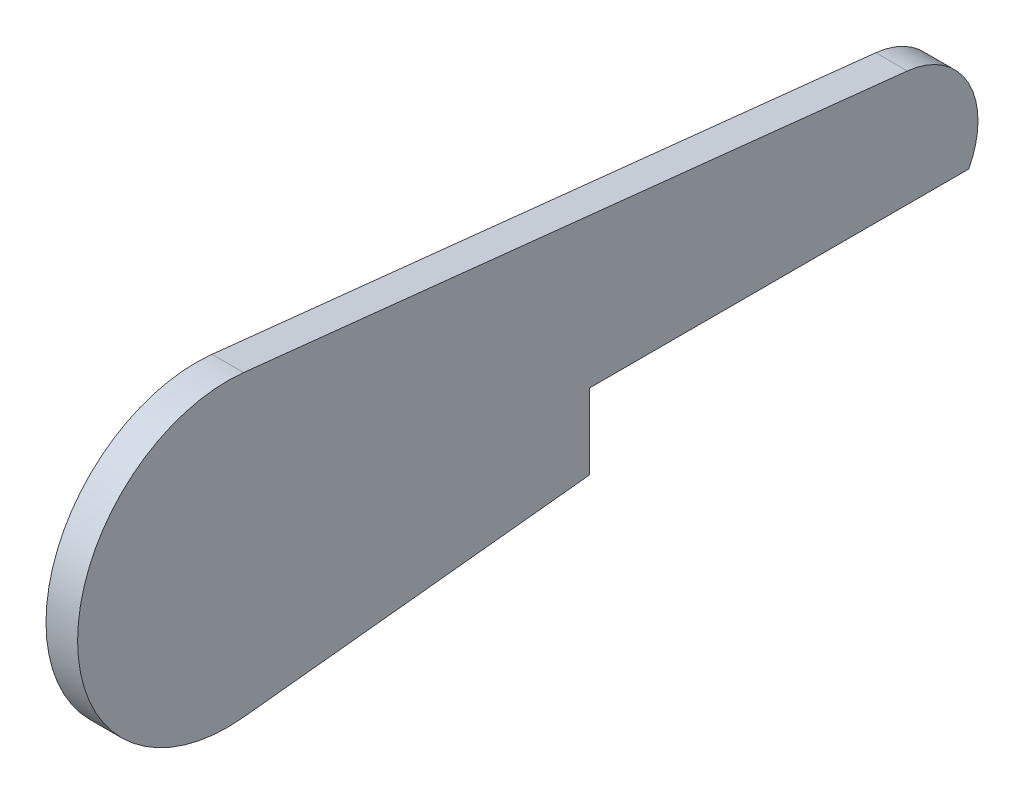
ISO-10303-21;
HEADER;
FILE_DESCRIPTION(('STEP AP214'),'2;1');
FILE_NAME('part.step','',(''),(''),'','','');
FILE_SCHEMA(('AUTOMOTIVE_DESIGN { 1 0 10303 214 1 1 1 1 }'));
ENDSEC;
DATA;
#1=APPLICATION_CONTEXT('core data for automotive mechanical design processes');
#2=APPLICATION_PROTOCOL_DEFINITION('international standard','automotive_design',2000,#1);
#3=PRODUCT_CONTEXT('',#1,'mechanical');
#4=PRODUCT('Part','Part','',(#3));
#5=PRODUCT_RELATED_PRODUCT_CATEGORY('part','',(#4));
#6=PRODUCT_DEFINITION_FORMATION('','',#4);
#7=PRODUCT_DEFINITION_CONTEXT('part definition',#1,'design');
#8=PRODUCT_DEFINITION('design','',#6,#7);
#9=PRODUCT_DEFINITION_SHAPE('','',#8);
#10=(LENGTH_UNIT() NAMED_UNIT(*) SI_UNIT(.MILLI.,.METRE.));
#11=(NAMED_UNIT(*) PLANE_ANGLE_UNIT() SI_UNIT($,.RADIAN.));
#12=(NAMED_UNIT(*) SI_UNIT($,.STERADIAN.) SOLID_ANGLE_UNIT());
#13=UNCERTAINTY_MEASURE_WITH_UNIT(LENGTH_MEASURE(1.E-05),#10,'distance_accuracy_value','');
#14=(GEOMETRIC_REPRESENTATION_CONTEXT(3) GLOBAL_UNCERTAINTY_ASSIGNED_CONTEXT((#13)) GLOBAL_UNIT_ASSIGNED_CONTEXT((#10,
#11,#12)) REPRESENTATION_CONTEXT('',''));
#15=CARTESIAN_POINT('',(0.,0.,0.));
#16=DIRECTION('',(0.,0.,1.));
#17=DIRECTION('',(1.,0.,0.));
#18=AXIS2_PLACEMENT_3D('',#15,#16,#17);
#19=CARTESIAN_POINT('',(5.,0.,0.));
#20=DIRECTION('',(-1.,0.,0.));
#21=DIRECTION('',(0.,0.,1.));
#22=AXIS2_PLACEMENT_3D('',#19,#20,#21);
#23=CYLINDRICAL_SURFACE('',#22,95.);
#24=DIRECTION('',(-1.,0.,0.));
#25=VECTOR('',#24,1.);
#26=CARTESIAN_POINT('',(5.,94.4659730760455,-10.0588235294118));
#27=LINE('',#26,#25);
#28=CARTESIAN_POINT('',(5.,94.4659730760455,-10.0588235294118));
#29=VERTEX_POINT('',#28);
#30=CARTESIAN_POINT('',(-15.,94.4659730760455,-10.0588235294117));
#31=VERTEX_POINT('',#30);
#32=EDGE_CURVE('E165',#29,#31,#27,.T.);
#33=ORIENTED_EDGE('',*,*,#32,.T.);
#34=CARTESIAN_POINT('',(-15.,0.,0.));
#35=DIRECTION('',(-1.,0.,0.));
#36=DIRECTION('',(0.,0.,1.));
#37=AXIS2_PLACEMENT_3D('',#34,#35,#36);
#38=CIRCLE('',#37,95.);
#39=CARTESIAN_POINT('',(-15.,-94.4659730760455,-10.0588235294117));
#40=VERTEX_POINT('',#39);
#41=EDGE_CURVE('E198',#40,#31,#38,.T.);
#42=ORIENTED_EDGE('',*,*,#41,.F.);
#43=DIRECTION('',(-1.,0.,0.));
#44=VECTOR('',#43,1.);
#45=CARTESIAN_POINT('',(5.,-94.4659730760455,-10.0588235294118));
#46=LINE('',#45,#44);
#47=CARTESIAN_POINT('',(5.,-94.4659730760455,-10.0588235294118));
#48=VERTEX_POINT('',#47);
#49=EDGE_CURVE('E147',#48,#40,#46,.T.);
#50=ORIENTED_EDGE('',*,*,#49,.F.);
#51=CARTESIAN_POINT('',(5.,0.,0.));
#52=DIRECTION('',(1.,0.,0.));
#53=DIRECTION('',(0.,0.,-1.));
#54=AXIS2_PLACEMENT_3D('',#51,#52,#53);
#55=CIRCLE('',#54,95.);
#56=EDGE_CURVE('E149',#29,#48,#55,.T.);
#57=ORIENTED_EDGE('',*,*,#56,.F.);
#58=EDGE_LOOP('',(#33,#42,#50,#57));
#59=FACE_BOUND('',#58,.T.);
#60=ADVANCED_FACE('F41',(#59),#23,.T.);
#61=CARTESIAN_POINT('',(5.,-49.7189331979187,-430.294117647059));
#62=DIRECTION('',(0.,0.994378663958374,0.105882352941176));
#63=DIRECTION('',(0.,-0.105882352941177,0.994378663958374));
#64=AXIS2_PLACEMENT_3D('',#61,#62,#63);
#65=PLANE('',#64);
#66=DIRECTION('',(0.,-0.105882352941176,0.994378663958374));
#67=VECTOR('',#66,1.);
#68=CARTESIAN_POINT('',(-15.,-49.7189331979187,-430.294117647059));
#69=LINE('',#68,#67);
#70=CARTESIAN_POINT('',(-15.,-71.1439222210405,-229.084460245787));
#71=VERTEX_POINT('',#70);
#72=EDGE_CURVE('E139',#71,#40,#69,.T.);
#73=ORIENTED_EDGE('',*,*,#72,.F.);
#74=DIRECTION('',(1.,0.,0.));
#75=VECTOR('',#74,1.);
#76=CARTESIAN_POINT('',(-15.,-71.1439222210405,-229.084460245787));
#77=LINE('',#76,#75);
#78=CARTESIAN_POINT('',(5.,-71.1439222210405,-229.084460245787));
#79=VERTEX_POINT('',#78);
#80=EDGE_CURVE('E122',#71,#79,#77,.T.);
#81=ORIENTED_EDGE('',*,*,#80,.T.);
#82=DIRECTION('',(0.,0.105882352941176,-0.994378663958374));
#83=VECTOR('',#82,1.);
#84=CARTESIAN_POINT('',(5.,-49.7189331979187,-430.294117647059));
#85=LINE('',#84,#83);
#86=EDGE_CURVE('E153',#48,#79,#85,.T.);
#87=ORIENTED_EDGE('',*,*,#86,.F.);
#88=ORIENTED_EDGE('',*,*,#49,.T.);
#89=EDGE_LOOP('',(#73,#81,#87,#88));
#90=FACE_BOUND('',#89,.T.);
#91=ADVANCED_FACE('F145',(#90),#65,.F.);
#92=CARTESIAN_POINT('',(5.,0.,-425.));
#93=DIRECTION('',(-1.,0.,0.));
#94=DIRECTION('',(0.,0.,1.));
#95=AXIS2_PLACEMENT_3D('',#92,#93,#94);
#96=CYLINDRICAL_SURFACE('',#95,50.);
#97=CARTESIAN_POINT('',(5.,0.,-425.));
#98=DIRECTION('',(1.,0.,0.));
#99=DIRECTION('',(0.,0.,-1.));
#100=AXIS2_PLACEMENT_3D('',#97,#98,#99);
#101=CIRCLE('',#100,50.);
#102=CARTESIAN_POINT('',(5.,-23.5038972967356,-469.131245301538));
#103=VERTEX_POINT('',#102);
#104=CARTESIAN_POINT('',(5.,49.7189331979187,-430.294117647059));
#105=VERTEX_POINT('',#104);
#106=EDGE_CURVE('E161',#103,#105,#101,.T.);
#107=ORIENTED_EDGE('',*,*,#106,.F.);
#108=DIRECTION('',(1.,0.,0.));
#109=VECTOR('',#108,1.);
#110=CARTESIAN_POINT('',(-15.,-23.5038972967356,-469.131245301538));
#111=LINE('',#110,#109);
#112=CARTESIAN_POINT('',(-15.,-23.5038972967356,-469.131245301538));
#113=VERTEX_POINT('',#112);
#114=EDGE_CURVE('E131',#113,#103,#111,.T.);
#115=ORIENTED_EDGE('',*,*,#114,.F.);
#116=CARTESIAN_POINT('',(-15.,0.,-425.));
#117=DIRECTION('',(-1.,0.,0.));
#118=DIRECTION('',(0.,0.,1.));
#119=AXIS2_PLACEMENT_3D('',#116,#117,#118);
#120=CIRCLE('',#119,50.);
#121=CARTESIAN_POINT('',(-15.,49.7189331979187,-430.294117647059));
#122=VERTEX_POINT('',#121);
#123=EDGE_CURVE('E150',#122,#113,#120,.T.);
#124=ORIENTED_EDGE('',*,*,#123,.F.);
#125=DIRECTION('',(-1.,0.,0.));
#126=VECTOR('',#125,1.);
#127=CARTESIAN_POINT('',(5.,49.7189331979187,-430.294117647059));
#128=LINE('',#127,#126);
#129=EDGE_CURVE('E167',#105,#122,#128,.T.);
#130=ORIENTED_EDGE('',*,*,#129,.F.);
#131=EDGE_LOOP('',(#107,#115,#124,#130));
#132=FACE_BOUND('',#131,.T.);
#133=ADVANCED_FACE('F208',(#132),#96,.T.);
#134=CARTESIAN_POINT('',(5.,94.4659730760455,-10.0588235294118));
#135=DIRECTION('',(0.,-0.994378663958374,0.105882352941176));
#136=DIRECTION('',(0.,-0.105882352941176,-0.994378663958374));
#137=AXIS2_PLACEMENT_3D('',#134,#135,#136);
#138=PLANE('',#137);
#139=ORIENTED_EDGE('',*,*,#129,.T.);
#140=DIRECTION('',(0.,-0.105882352941176,-0.994378663958374));
#141=VECTOR('',#140,1.);
#142=CARTESIAN_POINT('',(-15.,94.4659730760455,-10.0588235294117));
#143=LINE('',#142,#141);
#144=EDGE_CURVE('E156',#31,#122,#143,.T.);
#145=ORIENTED_EDGE('',*,*,#144,.F.);
#146=ORIENTED_EDGE('',*,*,#32,.F.);
#147=DIRECTION('',(0.,0.105882352941176,0.994378663958374));
#148=VECTOR('',#147,1.);
#149=CARTESIAN_POINT('',(5.,94.4659730760455,-10.0588235294118));
#150=LINE('',#149,#148);
#151=EDGE_CURVE('E163',#105,#29,#150,.T.);
#152=ORIENTED_EDGE('',*,*,#151,.F.);
#153=EDGE_LOOP('',(#139,#145,#146,#152));
#154=FACE_BOUND('',#153,.T.);
#155=ADVANCED_FACE('F253',(#154),#138,.F.);
#156=CARTESIAN_POINT('',(5.,0.,0.));
#157=DIRECTION('',(1.,0.,0.));
#158=DIRECTION('',(0.,0.,-1.));
#159=AXIS2_PLACEMENT_3D('',#156,#157,#158);
#160=PLANE('',#159);
#161=DIRECTION('',(0.,0.,1.));
#162=VECTOR('',#161,1.);
#163=CARTESIAN_POINT('',(5.,-23.5038972967356,0.));
#164=LINE('',#163,#162);
#165=CARTESIAN_POINT('',(5.,-23.5038972967356,-229.084460245776));
#166=VERTEX_POINT('',#165);
#167=EDGE_CURVE('E248',#103,#166,#164,.T.);
#168=ORIENTED_EDGE('',*,*,#167,.F.);
#169=ORIENTED_EDGE('',*,*,#106,.T.);
#170=ORIENTED_EDGE('',*,*,#151,.T.);
#171=ORIENTED_EDGE('',*,*,#56,.T.);
#172=ORIENTED_EDGE('',*,*,#86,.T.);
#173=DIRECTION('',(0.,-1.,0.));
#174=VECTOR('',#173,1.);
#175=CARTESIAN_POINT('',(5.,0.,-229.084460245776));
#176=LINE('',#175,#174);
#177=EDGE_CURVE('E127',#166,#79,#176,.T.);
#178=ORIENTED_EDGE('',*,*,#177,.F.);
#179=EDGE_LOOP('',(#168,#169,#170,#171,#172,#178));
#180=FACE_BOUND('',#179,.T.);
#181=ADVANCED_FACE('F250',(#180),#160,.T.);
#182=CARTESIAN_POINT('',(-15.,0.,0.));
#183=DIRECTION('',(-1.,0.,0.));
#184=DIRECTION('',(0.,0.,1.));
#185=AXIS2_PLACEMENT_3D('',#182,#183,#184);
#186=PLANE('',#185);
#187=DIRECTION('',(0.,0.,1.));
#188=VECTOR('',#187,1.);
#189=CARTESIAN_POINT('',(-15.,-23.5038972967356,0.));
#190=LINE('',#189,#188);
#191=CARTESIAN_POINT('',(-15.,-23.5038972967356,-463.374038253284));
#192=VERTEX_POINT('',#191);
#193=EDGE_CURVE('E143',#113,#192,#190,.T.);
#194=ORIENTED_EDGE('',*,*,#193,.T.);
#195=CARTESIAN_POINT('',(-15.,0.,-425.));
#196=DIRECTION('',(-1.,0.,0.));
#197=DIRECTION('',(0.,0.,1.));
#198=AXIS2_PLACEMENT_3D('',#195,#196,#197);
#199=CIRCLE('',#198,45.);
#200=CARTESIAN_POINT('',(-15.,44.7470398781268,-429.764705882353));
#201=VERTEX_POINT('',#200);
#202=EDGE_CURVE('E229',#201,#192,#199,.T.);
#203=ORIENTED_EDGE('',*,*,#202,.F.);
#204=DIRECTION('',(0.,-0.105882352941176,-0.994378663958374));
#205=VECTOR('',#204,1.);
#206=CARTESIAN_POINT('',(-15.,89.4940797562536,-9.52941176470582));
#207=LINE('',#206,#205);
#208=CARTESIAN_POINT('',(-15.,89.4940797562536,-9.52941176470582));
#209=VERTEX_POINT('',#208);
#210=EDGE_CURVE('E186',#209,#201,#207,.T.);
#211=ORIENTED_EDGE('',*,*,#210,.F.);
#212=CARTESIAN_POINT('',(-15.,0.,0.));
#213=DIRECTION('',(-1.,0.,0.));
#214=DIRECTION('',(0.,0.,1.));
#215=AXIS2_PLACEMENT_3D('',#212,#213,#214);
#216=CIRCLE('',#215,90.);
#217=CARTESIAN_POINT('',(-15.,-89.4940797562536,-9.52941176470587));
#218=VERTEX_POINT('',#217);
#219=EDGE_CURVE('E183',#218,#209,#216,.T.);
#220=ORIENTED_EDGE('',*,*,#219,.F.);
#221=DIRECTION('',(0.,-0.105882352941176,0.994378663958374));
#222=VECTOR('',#221,1.);
#223=CARTESIAN_POINT('',(-15.,-44.7470398781268,-429.764705882353));
#224=LINE('',#223,#222);
#225=CARTESIAN_POINT('',(-15.,-66.1156566505635,-229.084460245776));
#226=VERTEX_POINT('',#225);
#227=EDGE_CURVE('E142',#226,#218,#224,.T.);
#228=ORIENTED_EDGE('',*,*,#227,.F.);
#229=DIRECTION('',(0.,-1.,0.));
#230=VECTOR('',#229,1.);
#231=CARTESIAN_POINT('',(-15.,0.,-229.084460245776));
#232=LINE('',#231,#230);
#233=EDGE_CURVE('E125',#226,#71,#232,.T.);
#234=ORIENTED_EDGE('',*,*,#233,.T.);
#235=ORIENTED_EDGE('',*,*,#72,.T.);
#236=ORIENTED_EDGE('',*,*,#41,.T.);
#237=ORIENTED_EDGE('',*,*,#144,.T.);
#238=ORIENTED_EDGE('',*,*,#123,.T.);
#239=EDGE_LOOP('',(#194,#203,#211,#220,#228,#234,#235,#236,#237,#238));
#240=FACE_BOUND('',#239,.T.);
#241=ADVANCED_FACE('F137',(#240),#186,.T.);
#242=CARTESIAN_POINT('',(-15.,0.,0.));
#243=DIRECTION('',(1.,0.,0.));
#244=DIRECTION('',(0.,0.,-1.));
#245=AXIS2_PLACEMENT_3D('',#242,#243,#244);
#246=CYLINDRICAL_SURFACE('',#245,90.);
#247=CARTESIAN_POINT('',(0.,0.,0.));
#248=DIRECTION('',(-1.,0.,0.));
#249=DIRECTION('',(0.,0.,1.));
#250=AXIS2_PLACEMENT_3D('',#247,#248,#249);
#251=CIRCLE('',#250,90.);
#252=CARTESIAN_POINT('',(0.,-89.4940797562536,-9.52941176470587));
#253=VERTEX_POINT('',#252);
#254=CARTESIAN_POINT('',(0.,89.4940797562536,-9.52941176470582));
#255=VERTEX_POINT('',#254);
#256=EDGE_CURVE('E226',#253,#255,#251,.T.);
#257=ORIENTED_EDGE('',*,*,#256,.F.);
#258=DIRECTION('',(1.,0.,0.));
#259=VECTOR('',#258,1.);
#260=CARTESIAN_POINT('',(-15.,-89.4940797562536,-9.52941176470587));
#261=LINE('',#260,#259);
#262=EDGE_CURVE('E181',#218,#253,#261,.T.);
#263=ORIENTED_EDGE('',*,*,#262,.F.);
#264=ORIENTED_EDGE('',*,*,#219,.T.);
#265=DIRECTION('',(1.,0.,0.));
#266=VECTOR('',#265,1.);
#267=CARTESIAN_POINT('',(-15.,89.4940797562536,-9.52941176470582));
#268=LINE('',#267,#266);
#269=EDGE_CURVE('E195',#209,#255,#268,.T.);
#270=ORIENTED_EDGE('',*,*,#269,.T.);
#271=EDGE_LOOP('',(#257,#263,#264,#270));
#272=FACE_BOUND('',#271,.T.);
#273=ADVANCED_FACE('F241',(#272),#246,.F.);
#274=CARTESIAN_POINT('',(-15.,89.4940797562536,-9.52941176470582));
#275=DIRECTION('',(0.,-0.994378663958374,0.105882352941176));
#276=DIRECTION('',(0.,-0.105882352941176,-0.994378663958374));
#277=AXIS2_PLACEMENT_3D('',#274,#275,#276);
#278=PLANE('',#277);
#279=DIRECTION('',(0.,-0.105882352941176,-0.994378663958374));
#280=VECTOR('',#279,1.);
#281=CARTESIAN_POINT('',(0.,89.4940797562536,-9.52941176470582));
#282=LINE('',#281,#280);
#283=CARTESIAN_POINT('',(0.,44.7470398781268,-429.764705882353));
#284=VERTEX_POINT('',#283);
#285=EDGE_CURVE('E188',#255,#284,#282,.T.);
#286=ORIENTED_EDGE('',*,*,#285,.F.);
#287=ORIENTED_EDGE('',*,*,#269,.F.);
#288=ORIENTED_EDGE('',*,*,#210,.T.);
#289=DIRECTION('',(1.,0.,0.));
#290=VECTOR('',#289,1.);
#291=CARTESIAN_POINT('',(-15.,44.7470398781268,-429.764705882353));
#292=LINE('',#291,#290);
#293=EDGE_CURVE('E193',#201,#284,#292,.T.);
#294=ORIENTED_EDGE('',*,*,#293,.T.);
#295=EDGE_LOOP('',(#286,#287,#288,#294));
#296=FACE_BOUND('',#295,.T.);
#297=ADVANCED_FACE('F237',(#296),#278,.T.);
#298=CARTESIAN_POINT('',(-15.,0.,-425.));
#299=DIRECTION('',(1.,0.,0.));
#300=DIRECTION('',(0.,0.,-1.));
#301=AXIS2_PLACEMENT_3D('',#298,#299,#300);
#302=CYLINDRICAL_SURFACE('',#301,45.);
#303=DIRECTION('',(1.,0.,0.));
#304=VECTOR('',#303,1.);
#305=CARTESIAN_POINT('',(-15.,-23.5038972967356,-463.374038253284));
#306=LINE('',#305,#304);
#307=CARTESIAN_POINT('',(0.,-23.5038972967356,-463.374038253284));
#308=VERTEX_POINT('',#307);
#309=EDGE_CURVE('E214',#308,#192,#306,.F.);
#310=ORIENTED_EDGE('',*,*,#309,.F.);
#311=CARTESIAN_POINT('',(0.,0.,-425.));
#312=DIRECTION('',(-1.,0.,0.));
#313=DIRECTION('',(0.,0.,1.));
#314=AXIS2_PLACEMENT_3D('',#311,#312,#313);
#315=CIRCLE('',#314,45.);
#316=EDGE_CURVE('E184',#284,#308,#315,.T.);
#317=ORIENTED_EDGE('',*,*,#316,.F.);
#318=ORIENTED_EDGE('',*,*,#293,.F.);
#319=ORIENTED_EDGE('',*,*,#202,.T.);
#320=EDGE_LOOP('',(#310,#317,#318,#319));
#321=FACE_BOUND('',#320,.T.);
#322=ADVANCED_FACE('F245',(#321),#302,.F.);
#323=CARTESIAN_POINT('',(-15.,-44.7470398781268,-429.764705882353));
#324=DIRECTION('',(0.,0.994378663958374,0.105882352941176));
#325=DIRECTION('',(0.,-0.105882352941177,0.994378663958374));
#326=AXIS2_PLACEMENT_3D('',#323,#324,#325);
#327=PLANE('',#326);
#328=DIRECTION('',(1.,0.,0.));
#329=VECTOR('',#328,1.);
#330=CARTESIAN_POINT('',(-15.,-66.1156566505635,-229.084460245776));
#331=LINE('',#330,#329);
#332=CARTESIAN_POINT('',(0.,-66.1156566505634,-229.084460245776));
#333=VERTEX_POINT('',#332);
#334=EDGE_CURVE('E55',#226,#333,#331,.T.);
#335=ORIENTED_EDGE('',*,*,#334,.F.);
#336=ORIENTED_EDGE('',*,*,#227,.T.);
#337=ORIENTED_EDGE('',*,*,#262,.T.);
#338=DIRECTION('',(0.,-0.105882352941176,0.994378663958374));
#339=VECTOR('',#338,1.);
#340=CARTESIAN_POINT('',(0.,-44.7470398781268,-429.764705882353));
#341=LINE('',#340,#339);
#342=EDGE_CURVE('E62',#333,#253,#341,.T.);
#343=ORIENTED_EDGE('',*,*,#342,.F.);
#344=EDGE_LOOP('',(#335,#336,#337,#343));
#345=FACE_BOUND('',#344,.T.);
#346=ADVANCED_FACE('F179',(#345),#327,.T.);
#347=CARTESIAN_POINT('',(0.,0.,0.));
#348=DIRECTION('',(1.,0.,0.));
#349=DIRECTION('',(0.,0.,-1.));
#350=AXIS2_PLACEMENT_3D('',#347,#348,#349);
#351=PLANE('',#350);
#352=CARTESIAN_POINT('',(0.,0.,0.));
#353=DIRECTION('',(1.,0.,0.));
#354=DIRECTION('',(0.,0.,-1.));
#355=AXIS2_PLACEMENT_3D('',#352,#353,#354);
#356=CIRCLE('',#355,15.5726355273785);
#357=CARTESIAN_POINT('',(0.,0.,-15.5726355273785));
#358=VERTEX_POINT('',#357);
#359=EDGE_CURVE('E173',#358,#358,#356,.F.);
#360=ORIENTED_EDGE('',*,*,#359,.F.);
#361=EDGE_LOOP('',(#360));
#362=FACE_BOUND('',#361,.T.);
#363=CARTESIAN_POINT('',(0.,0.,-425.));
#364=DIRECTION('',(1.,0.,0.));
#365=DIRECTION('',(0.,0.,-1.));
#366=AXIS2_PLACEMENT_3D('',#363,#364,#365);
#367=CIRCLE('',#366,10.5607760599858);
#368=CARTESIAN_POINT('',(0.,0.,-435.560776059986));
#369=VERTEX_POINT('',#368);
#370=EDGE_CURVE('E170',#369,#369,#367,.F.);
#371=ORIENTED_EDGE('',*,*,#370,.F.);
#372=EDGE_LOOP('',(#371));
#373=FACE_BOUND('',#372,.T.);
#374=ORIENTED_EDGE('',*,*,#316,.T.);
#375=DIRECTION('',(0.,0.,1.));
#376=VECTOR('',#375,1.);
#377=CARTESIAN_POINT('',(0.,-23.5038972967356,0.));
#378=LINE('',#377,#376);
#379=CARTESIAN_POINT('',(0.,-23.5038972967356,-229.084460245776));
#380=VERTEX_POINT('',#379);
#381=EDGE_CURVE('E11',#308,#380,#378,.T.);
#382=ORIENTED_EDGE('',*,*,#381,.T.);
#383=DIRECTION('',(0.,-1.,0.));
#384=VECTOR('',#383,1.);
#385=CARTESIAN_POINT('',(0.,0.,-229.084460245776));
#386=LINE('',#385,#384);
#387=EDGE_CURVE('E48',#380,#333,#386,.T.);
#388=ORIENTED_EDGE('',*,*,#387,.T.);
#389=ORIENTED_EDGE('',*,*,#342,.T.);
#390=ORIENTED_EDGE('',*,*,#256,.T.);
#391=ORIENTED_EDGE('',*,*,#285,.T.);
#392=EDGE_LOOP('',(#374,#382,#388,#389,#390,#391));
#393=FACE_BOUND('',#392,.T.);
#394=ADVANCED_FACE('F176',(#362,#373,#393),#351,.F.);
#395=CARTESIAN_POINT('',(-2.,0.,-425.));
#396=DIRECTION('',(1.,0.,0.));
#397=DIRECTION('',(0.,0.,-1.));
#398=AXIS2_PLACEMENT_3D('',#395,#396,#397);
#399=CYLINDRICAL_SURFACE('',#398,10.5607760599858);
#400=CARTESIAN_POINT('',(-2.,0.,-425.));
#401=DIRECTION('',(-1.,0.,0.));
#402=DIRECTION('',(0.,0.,1.));
#403=AXIS2_PLACEMENT_3D('',#400,#401,#402);
#404=CIRCLE('',#403,10.5607760599858);
#405=CARTESIAN_POINT('',(-2.,0.,-414.439223940014));
#406=VERTEX_POINT('',#405);
#407=EDGE_CURVE('E224',#406,#406,#404,.T.);
#408=ORIENTED_EDGE('',*,*,#407,.F.);
#409=EDGE_LOOP('',(#408));
#410=FACE_BOUND('',#409,.T.);
#411=ORIENTED_EDGE('',*,*,#370,.T.);
#412=EDGE_LOOP('',(#411));
#413=FACE_BOUND('',#412,.T.);
#414=ADVANCED_FACE('F317',(#410,#413),#399,.T.);
#415=CARTESIAN_POINT('',(-2.,0.,-425.));
#416=DIRECTION('',(-1.,0.,0.));
#417=DIRECTION('',(0.,0.,1.));
#418=AXIS2_PLACEMENT_3D('',#415,#416,#417);
#419=PLANE('',#418);
#420=ORIENTED_EDGE('',*,*,#407,.T.);
#421=EDGE_LOOP('',(#420));
#422=FACE_BOUND('',#421,.T.);
#423=ADVANCED_FACE('F348',(#422),#419,.T.);
#424=CARTESIAN_POINT('',(-2.,0.,0.));
#425=DIRECTION('',(1.,0.,0.));
#426=DIRECTION('',(0.,0.,-1.));
#427=AXIS2_PLACEMENT_3D('',#424,#425,#426);
#428=CYLINDRICAL_SURFACE('',#427,15.5726355273785);
#429=CARTESIAN_POINT('',(-2.,0.,0.));
#430=DIRECTION('',(-1.,0.,0.));
#431=DIRECTION('',(0.,0.,1.));
#432=AXIS2_PLACEMENT_3D('',#429,#430,#431);
#433=CIRCLE('',#432,15.5726355273785);
#434=CARTESIAN_POINT('',(-2.,0.,15.5726355273785));
#435=VERTEX_POINT('',#434);
#436=EDGE_CURVE('E221',#435,#435,#433,.T.);
#437=ORIENTED_EDGE('',*,*,#436,.F.);
#438=EDGE_LOOP('',(#437));
#439=FACE_BOUND('',#438,.T.);
#440=ORIENTED_EDGE('',*,*,#359,.T.);
#441=EDGE_LOOP('',(#440));
#442=FACE_BOUND('',#441,.T.);
#443=ADVANCED_FACE('F340',(#439,#442),#428,.T.);
#444=CARTESIAN_POINT('',(-2.,0.,0.));
#445=DIRECTION('',(-1.,0.,0.));
#446=DIRECTION('',(0.,0.,1.));
#447=AXIS2_PLACEMENT_3D('',#444,#445,#446);
#448=PLANE('',#447);
#449=ORIENTED_EDGE('',*,*,#436,.T.);
#450=EDGE_LOOP('',(#449));
#451=FACE_BOUND('',#450,.T.);
#452=ADVANCED_FACE('F275',(#451),#448,.T.);
#453=CARTESIAN_POINT('',(-15.,-23.5038972967356,0.));
#454=DIRECTION('',(0.,1.,0.));
#455=DIRECTION('',(0.,0.,1.));
#456=AXIS2_PLACEMENT_3D('',#453,#454,#455);
#457=PLANE('',#456);
#458=ORIENTED_EDGE('',*,*,#309,.T.);
#459=ORIENTED_EDGE('',*,*,#193,.F.);
#460=ORIENTED_EDGE('',*,*,#114,.T.);
#461=ORIENTED_EDGE('',*,*,#167,.T.);
#462=DIRECTION('',(1.,0.,0.));
#463=VECTOR('',#462,1.);
#464=CARTESIAN_POINT('',(-15.,-23.5038972967356,-229.084460245776));
#465=LINE('',#464,#463);
#466=EDGE_CURVE('E132',#380,#166,#465,.T.);
#467=ORIENTED_EDGE('',*,*,#466,.F.);
#468=ORIENTED_EDGE('',*,*,#381,.F.);
#469=EDGE_LOOP('',(#458,#459,#460,#461,#467,#468));
#470=FACE_BOUND('',#469,.T.);
#471=ADVANCED_FACE('F246',(#470),#457,.F.);
#472=CARTESIAN_POINT('',(-15.,0.,-229.084460245776));
#473=DIRECTION('',(0.,0.,1.));
#474=DIRECTION('',(1.,0.,0.));
#475=AXIS2_PLACEMENT_3D('',#472,#473,#474);
#476=PLANE('',#475);
#477=ORIENTED_EDGE('',*,*,#334,.T.);
#478=ORIENTED_EDGE('',*,*,#387,.F.);
#479=ORIENTED_EDGE('',*,*,#466,.T.);
#480=ORIENTED_EDGE('',*,*,#177,.T.);
#481=ORIENTED_EDGE('',*,*,#80,.F.);
#482=ORIENTED_EDGE('',*,*,#233,.F.);
#483=EDGE_LOOP('',(#477,#478,#479,#480,#481,#482));
#484=FACE_BOUND('',#483,.T.);
#485=ADVANCED_FACE('F124',(#484),#476,.F.);
#486=CLOSED_SHELL('',(#60,#91,#133,#155,#181,#241,#273,#297,#322,#346,#394,#414,#423,#443,#452,
#471,#485));
#487=MANIFOLD_SOLID_BREP('B2',#486);
#488=ADVANCED_BREP_SHAPE_REPRESENTATION('',(#18,#487),#14);
#489=SHAPE_DEFINITION_REPRESENTATION(#9,#488);
ENDSEC;
END-ISO-10303-21;
